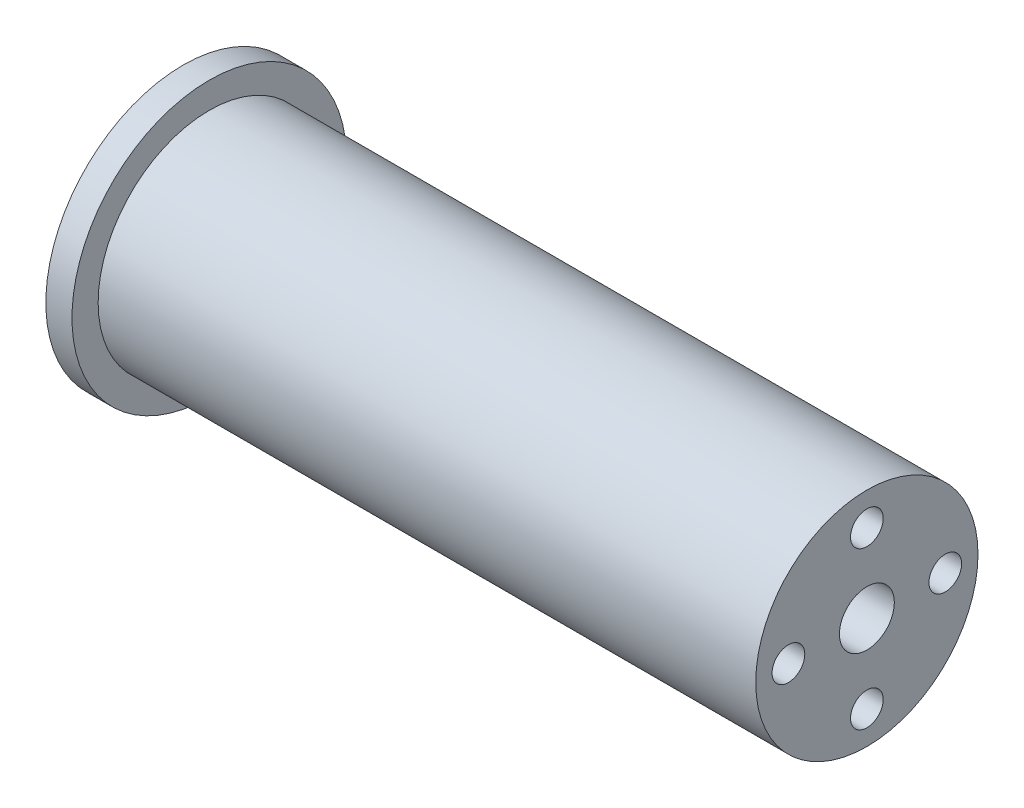
ISO-10303-21;
HEADER;
FILE_DESCRIPTION(('STEP AP214'),'2;1');
FILE_NAME('part.step','',(''),(''),'','','');
FILE_SCHEMA(('AUTOMOTIVE_DESIGN { 1 0 10303 214 1 1 1 1 }'));
ENDSEC;
DATA;
#1=APPLICATION_CONTEXT('core data for automotive mechanical design processes');
#2=APPLICATION_PROTOCOL_DEFINITION('international standard','automotive_design',2000,#1);
#3=PRODUCT_CONTEXT('',#1,'mechanical');
#4=PRODUCT('Part','Part','',(#3));
#5=PRODUCT_RELATED_PRODUCT_CATEGORY('part','',(#4));
#6=PRODUCT_DEFINITION_FORMATION('','',#4);
#7=PRODUCT_DEFINITION_CONTEXT('part definition',#1,'design');
#8=PRODUCT_DEFINITION('design','',#6,#7);
#9=PRODUCT_DEFINITION_SHAPE('','',#8);
#10=(LENGTH_UNIT() NAMED_UNIT(*) SI_UNIT(.MILLI.,.METRE.));
#11=(NAMED_UNIT(*) PLANE_ANGLE_UNIT() SI_UNIT($,.RADIAN.));
#12=(NAMED_UNIT(*) SI_UNIT($,.STERADIAN.) SOLID_ANGLE_UNIT());
#13=UNCERTAINTY_MEASURE_WITH_UNIT(LENGTH_MEASURE(1.E-05),#10,'distance_accuracy_value','');
#14=(GEOMETRIC_REPRESENTATION_CONTEXT(3) GLOBAL_UNCERTAINTY_ASSIGNED_CONTEXT((#13)) GLOBAL_UNIT_ASSIGNED_CONTEXT((#10,
#11,#12)) REPRESENTATION_CONTEXT('',''));
#15=CARTESIAN_POINT('',(0.,0.,0.));
#16=DIRECTION('',(0.,0.,1.));
#17=DIRECTION('',(1.,0.,0.));
#18=AXIS2_PLACEMENT_3D('',#15,#16,#17);
#19=CARTESIAN_POINT('',(57.3004303095137,-0.500000000036742,0.));
#20=DIRECTION('',(-1.,0.,0.));
#21=DIRECTION('',(0.,-1.,0.));
#22=AXIS2_PLACEMENT_3D('',#19,#20,#21);
#23=CYLINDRICAL_SURFACE('',#22,10.4999999999632);
#24=CARTESIAN_POINT('',(59.3004303095137,-0.500000000036742,0.));
#25=DIRECTION('',(-1.,0.,0.));
#26=DIRECTION('',(0.,-1.,0.));
#27=AXIS2_PLACEMENT_3D('',#24,#25,#26);
#28=CIRCLE('',#27,10.4999999999632);
#29=CARTESIAN_POINT('',(59.3004303095137,-11.,0.));
#30=VERTEX_POINT('',#29);
#31=EDGE_CURVE('E11',#30,#30,#28,.T.);
#32=ORIENTED_EDGE('',*,*,#31,.T.);
#33=EDGE_LOOP('',(#32));
#34=FACE_BOUND('',#33,.T.);
#35=CARTESIAN_POINT('',(57.3004303095137,-0.500000000036742,0.));
#36=DIRECTION('',(-1.,0.,0.));
#37=DIRECTION('',(0.,-1.,0.));
#38=AXIS2_PLACEMENT_3D('',#35,#36,#37);
#39=CIRCLE('',#38,10.4999999999632);
#40=CARTESIAN_POINT('',(57.3004303095137,-11.,0.));
#41=VERTEX_POINT('',#40);
#42=EDGE_CURVE('E96',#41,#41,#39,.T.);
#43=ORIENTED_EDGE('',*,*,#42,.F.);
#44=EDGE_LOOP('',(#43));
#45=FACE_BOUND('',#44,.T.);
#46=ADVANCED_FACE('F39',(#34,#45),#23,.T.);
#47=CARTESIAN_POINT('',(59.3004303095137,-11.,0.));
#48=DIRECTION('',(1.,0.,0.));
#49=DIRECTION('',(0.,1.,0.));
#50=AXIS2_PLACEMENT_3D('',#47,#48,#49);
#51=PLANE('',#50);
#52=CARTESIAN_POINT('',(59.3004303095138,-0.500000000036742,0.));
#53=DIRECTION('',(-1.,0.,0.));
#54=DIRECTION('',(0.,-1.,0.));
#55=AXIS2_PLACEMENT_3D('',#52,#53,#54);
#56=CIRCLE('',#55,8.49999999996325);
#57=CARTESIAN_POINT('',(59.3004303095138,-8.99999999999999,0.));
#58=VERTEX_POINT('',#57);
#59=EDGE_CURVE('E47',#58,#58,#56,.T.);
#60=ORIENTED_EDGE('',*,*,#59,.T.);
#61=EDGE_LOOP('',(#60));
#62=FACE_BOUND('',#61,.T.);
#63=ORIENTED_EDGE('',*,*,#31,.F.);
#64=EDGE_LOOP('',(#63));
#65=FACE_BOUND('',#64,.T.);
#66=ADVANCED_FACE('F132',(#62,#65),#51,.T.);
#67=CARTESIAN_POINT('',(57.3004303095137,-0.500000000036742,0.));
#68=DIRECTION('',(-1.,0.,0.));
#69=DIRECTION('',(0.,-1.,0.));
#70=AXIS2_PLACEMENT_3D('',#67,#68,#69);
#71=CYLINDRICAL_SURFACE('',#70,8.49999999996325);
#72=CARTESIAN_POINT('',(109.600860619028,-0.500000000036732,0.));
#73=DIRECTION('',(-1.,0.,0.));
#74=DIRECTION('',(0.,-1.,0.));
#75=AXIS2_PLACEMENT_3D('',#72,#73,#74);
#76=CIRCLE('',#75,8.49999999996325);
#77=CARTESIAN_POINT('',(109.600860619028,-8.99999999999998,0.));
#78=VERTEX_POINT('',#77);
#79=EDGE_CURVE('E99',#78,#78,#76,.T.);
#80=ORIENTED_EDGE('',*,*,#79,.T.);
#81=EDGE_LOOP('',(#80));
#82=FACE_BOUND('',#81,.T.);
#83=ORIENTED_EDGE('',*,*,#59,.F.);
#84=EDGE_LOOP('',(#83));
#85=FACE_BOUND('',#84,.T.);
#86=ADVANCED_FACE('F137',(#82,#85),#71,.T.);
#87=CARTESIAN_POINT('',(109.600860619028,-0.500000000036732,0.));
#88=DIRECTION('',(1.,0.,0.));
#89=DIRECTION('',(0.,1.,0.));
#90=AXIS2_PLACEMENT_3D('',#87,#88,#89);
#91=PLANE('',#90);
#92=CARTESIAN_POINT('',(109.600860619028,-0.499999999999996,0.));
#93=DIRECTION('',(1.,0.,0.));
#94=DIRECTION('',(0.,0.,-1.));
#95=AXIS2_PLACEMENT_3D('',#92,#93,#94);
#96=CIRCLE('',#95,2.1);
#97=CARTESIAN_POINT('',(109.600860619028,-0.499999999999996,-2.1));
#98=VERTEX_POINT('',#97);
#99=EDGE_CURVE('E108',#98,#98,#96,.T.);
#100=ORIENTED_EDGE('',*,*,#99,.F.);
#101=EDGE_LOOP('',(#100));
#102=FACE_BOUND('',#101,.T.);
#103=CARTESIAN_POINT('',(109.600860619028,-0.500000000036795,-5.99999999996325));
#104=DIRECTION('',(1.,0.,0.));
#105=DIRECTION('',(0.,0.,-1.));
#106=AXIS2_PLACEMENT_3D('',#103,#104,#105);
#107=CIRCLE('',#106,1.25);
#108=CARTESIAN_POINT('',(109.600860619028,-0.500000000036795,-7.24999999996325));
#109=VERTEX_POINT('',#108);
#110=EDGE_CURVE('E72',#109,#109,#107,.T.);
#111=ORIENTED_EDGE('',*,*,#110,.F.);
#112=EDGE_LOOP('',(#111));
#113=FACE_BOUND('',#112,.T.);
#114=CARTESIAN_POINT('',(109.600860619028,5.49999999992652,0.));
#115=DIRECTION('',(1.,0.,0.));
#116=DIRECTION('',(0.,0.,-1.));
#117=AXIS2_PLACEMENT_3D('',#114,#115,#116);
#118=CIRCLE('',#117,1.25);
#119=CARTESIAN_POINT('',(109.600860619028,5.49999999992652,-1.25));
#120=VERTEX_POINT('',#119);
#121=EDGE_CURVE('E71',#120,#120,#118,.T.);
#122=ORIENTED_EDGE('',*,*,#121,.F.);
#123=EDGE_LOOP('',(#122));
#124=FACE_BOUND('',#123,.T.);
#125=CARTESIAN_POINT('',(109.600860619028,-0.500000000036711,5.99999999996325));
#126=DIRECTION('',(1.,0.,0.));
#127=DIRECTION('',(0.,0.,-1.));
#128=AXIS2_PLACEMENT_3D('',#125,#126,#127);
#129=CIRCLE('',#128,1.25);
#130=CARTESIAN_POINT('',(109.600860619028,-0.500000000036711,4.74999999996325));
#131=VERTEX_POINT('',#130);
#132=EDGE_CURVE('E84',#131,#131,#129,.T.);
#133=ORIENTED_EDGE('',*,*,#132,.F.);
#134=EDGE_LOOP('',(#133));
#135=FACE_BOUND('',#134,.T.);
#136=CARTESIAN_POINT('',(109.600860619028,-6.49999999999998,0.));
#137=DIRECTION('',(1.,0.,0.));
#138=DIRECTION('',(0.,0.,-1.));
#139=AXIS2_PLACEMENT_3D('',#136,#137,#138);
#140=CIRCLE('',#139,1.25);
#141=CARTESIAN_POINT('',(109.600860619028,-6.49999999999998,-1.25));
#142=VERTEX_POINT('',#141);
#143=EDGE_CURVE('E90',#142,#142,#140,.T.);
#144=ORIENTED_EDGE('',*,*,#143,.F.);
#145=EDGE_LOOP('',(#144));
#146=FACE_BOUND('',#145,.T.);
#147=ORIENTED_EDGE('',*,*,#79,.F.);
#148=EDGE_LOOP('',(#147));
#149=FACE_BOUND('',#148,.T.);
#150=ADVANCED_FACE('F127',(#102,#113,#124,#135,#146,#149),#91,.T.);
#151=CARTESIAN_POINT('',(57.3004303095137,-11.,0.));
#152=DIRECTION('',(-1.,0.,0.));
#153=DIRECTION('',(0.,-1.,0.));
#154=AXIS2_PLACEMENT_3D('',#151,#152,#153);
#155=PLANE('',#154);
#156=CARTESIAN_POINT('',(57.3004303095137,-0.500000000000004,0.));
#157=DIRECTION('',(-1.,0.,0.));
#158=DIRECTION('',(0.,0.,1.));
#159=AXIS2_PLACEMENT_3D('',#156,#157,#158);
#160=CIRCLE('',#159,2.5);
#161=CARTESIAN_POINT('',(57.3004303095137,-0.500000000000004,2.5));
#162=VERTEX_POINT('',#161);
#163=EDGE_CURVE('E117',#162,#162,#160,.T.);
#164=ORIENTED_EDGE('',*,*,#163,.F.);
#165=EDGE_LOOP('',(#164));
#166=FACE_BOUND('',#165,.T.);
#167=ORIENTED_EDGE('',*,*,#42,.T.);
#168=EDGE_LOOP('',(#167));
#169=FACE_BOUND('',#168,.T.);
#170=ADVANCED_FACE('F123',(#166,#169),#155,.T.);
#171=CARTESIAN_POINT('',(103.600860619028,-6.49999999999998,0.));
#172=DIRECTION('',(1.,0.,0.));
#173=DIRECTION('',(0.,0.,-1.));
#174=AXIS2_PLACEMENT_3D('',#171,#172,#173);
#175=CONICAL_SURFACE('',#174,1.25,1.02974425867666);
#176=CARTESIAN_POINT('',(102.849784845243,-6.49999999999998,0.));
#177=VERTEX_POINT('',#176);
#178=VERTEX_LOOP('',#177);
#179=FACE_BOUND('',#178,.T.);
#180=CARTESIAN_POINT('',(103.600860619028,-6.49999999999998,0.));
#181=DIRECTION('',(1.,0.,0.));
#182=DIRECTION('',(0.,0.,-1.));
#183=AXIS2_PLACEMENT_3D('',#180,#181,#182);
#184=CIRCLE('',#183,1.25);
#185=CARTESIAN_POINT('',(103.600860619028,-6.49999999999998,-1.25));
#186=VERTEX_POINT('',#185);
#187=EDGE_CURVE('E93',#186,#186,#184,.T.);
#188=ORIENTED_EDGE('',*,*,#187,.T.);
#189=EDGE_LOOP('',(#188));
#190=FACE_BOUND('',#189,.T.);
#191=ADVANCED_FACE('F126',(#179,#190),#175,.F.);
#192=CARTESIAN_POINT('',(109.600860619028,-6.49999999999998,0.));
#193=DIRECTION('',(1.,0.,0.));
#194=DIRECTION('',(0.,0.,-1.));
#195=AXIS2_PLACEMENT_3D('',#192,#193,#194);
#196=CYLINDRICAL_SURFACE('',#195,1.25);
#197=ORIENTED_EDGE('',*,*,#187,.F.);
#198=EDGE_LOOP('',(#197));
#199=FACE_BOUND('',#198,.T.);
#200=ORIENTED_EDGE('',*,*,#143,.T.);
#201=EDGE_LOOP('',(#200));
#202=FACE_BOUND('',#201,.T.);
#203=ADVANCED_FACE('F152',(#199,#202),#196,.F.);
#204=CARTESIAN_POINT('',(103.600860619028,-0.500000000036711,5.99999999996325));
#205=DIRECTION('',(1.,0.,0.));
#206=DIRECTION('',(0.,0.,-1.));
#207=AXIS2_PLACEMENT_3D('',#204,#205,#206);
#208=CONICAL_SURFACE('',#207,1.25,1.02974425867666);
#209=CARTESIAN_POINT('',(102.849784845243,-0.500000000036713,5.99999999996325));
#210=VERTEX_POINT('',#209);
#211=VERTEX_LOOP('',#210);
#212=FACE_BOUND('',#211,.T.);
#213=CARTESIAN_POINT('',(103.600860619028,-0.500000000036711,5.99999999996325));
#214=DIRECTION('',(1.,0.,0.));
#215=DIRECTION('',(0.,0.,-1.));
#216=AXIS2_PLACEMENT_3D('',#213,#214,#215);
#217=CIRCLE('',#216,1.25);
#218=CARTESIAN_POINT('',(103.600860619028,-0.500000000036711,4.74999999996325));
#219=VERTEX_POINT('',#218);
#220=EDGE_CURVE('E87',#219,#219,#217,.T.);
#221=ORIENTED_EDGE('',*,*,#220,.T.);
#222=EDGE_LOOP('',(#221));
#223=FACE_BOUND('',#222,.T.);
#224=ADVANCED_FACE('F155',(#212,#223),#208,.F.);
#225=CARTESIAN_POINT('',(109.600860619028,-0.500000000036711,5.99999999996325));
#226=DIRECTION('',(1.,0.,0.));
#227=DIRECTION('',(0.,0.,-1.));
#228=AXIS2_PLACEMENT_3D('',#225,#226,#227);
#229=CYLINDRICAL_SURFACE('',#228,1.25);
#230=ORIENTED_EDGE('',*,*,#220,.F.);
#231=EDGE_LOOP('',(#230));
#232=FACE_BOUND('',#231,.T.);
#233=ORIENTED_EDGE('',*,*,#132,.T.);
#234=EDGE_LOOP('',(#233));
#235=FACE_BOUND('',#234,.T.);
#236=ADVANCED_FACE('F159',(#232,#235),#229,.F.);
#237=CARTESIAN_POINT('',(103.600860619028,5.49999999992652,0.));
#238=DIRECTION('',(1.,0.,0.));
#239=DIRECTION('',(0.,0.,-1.));
#240=AXIS2_PLACEMENT_3D('',#237,#238,#239);
#241=CONICAL_SURFACE('',#240,1.25,1.02974425867666);
#242=CARTESIAN_POINT('',(102.849784845243,5.49999999992651,0.));
#243=VERTEX_POINT('',#242);
#244=VERTEX_LOOP('',#243);
#245=FACE_BOUND('',#244,.T.);
#246=CARTESIAN_POINT('',(103.600860619028,5.49999999992652,0.));
#247=DIRECTION('',(1.,0.,0.));
#248=DIRECTION('',(0.,0.,-1.));
#249=AXIS2_PLACEMENT_3D('',#246,#247,#248);
#250=CIRCLE('',#249,1.25);
#251=CARTESIAN_POINT('',(103.600860619028,5.49999999992652,-1.25));
#252=VERTEX_POINT('',#251);
#253=EDGE_CURVE('E75',#252,#252,#250,.T.);
#254=ORIENTED_EDGE('',*,*,#253,.T.);
#255=EDGE_LOOP('',(#254));
#256=FACE_BOUND('',#255,.T.);
#257=ADVANCED_FACE('F162',(#245,#256),#241,.F.);
#258=CARTESIAN_POINT('',(109.600860619028,5.49999999992652,0.));
#259=DIRECTION('',(1.,0.,0.));
#260=DIRECTION('',(0.,0.,-1.));
#261=AXIS2_PLACEMENT_3D('',#258,#259,#260);
#262=CYLINDRICAL_SURFACE('',#261,1.25);
#263=ORIENTED_EDGE('',*,*,#253,.F.);
#264=EDGE_LOOP('',(#263));
#265=FACE_BOUND('',#264,.T.);
#266=ORIENTED_EDGE('',*,*,#121,.T.);
#267=EDGE_LOOP('',(#266));
#268=FACE_BOUND('',#267,.T.);
#269=ADVANCED_FACE('F65',(#265,#268),#262,.F.);
#270=CARTESIAN_POINT('',(103.600860619028,-0.500000000036795,-5.99999999996325));
#271=DIRECTION('',(1.,0.,0.));
#272=DIRECTION('',(0.,0.,-1.));
#273=AXIS2_PLACEMENT_3D('',#270,#271,#272);
#274=CONICAL_SURFACE('',#273,1.25,1.02974425867666);
#275=CARTESIAN_POINT('',(102.849784845243,-0.500000000036797,-5.99999999996325));
#276=VERTEX_POINT('',#275);
#277=VERTEX_LOOP('',#276);
#278=FACE_BOUND('',#277,.T.);
#279=CARTESIAN_POINT('',(103.600860619028,-0.500000000036795,-5.99999999996325));
#280=DIRECTION('',(1.,0.,0.));
#281=DIRECTION('',(0.,0.,-1.));
#282=AXIS2_PLACEMENT_3D('',#279,#280,#281);
#283=CIRCLE('',#282,1.25);
#284=CARTESIAN_POINT('',(103.600860619028,-0.500000000036795,-7.24999999996325));
#285=VERTEX_POINT('',#284);
#286=EDGE_CURVE('E69',#285,#285,#283,.T.);
#287=ORIENTED_EDGE('',*,*,#286,.T.);
#288=EDGE_LOOP('',(#287));
#289=FACE_BOUND('',#288,.T.);
#290=ADVANCED_FACE('F61',(#278,#289),#274,.F.);
#291=CARTESIAN_POINT('',(109.600860619028,-0.500000000036795,-5.99999999996325));
#292=DIRECTION('',(1.,0.,0.));
#293=DIRECTION('',(0.,0.,-1.));
#294=AXIS2_PLACEMENT_3D('',#291,#292,#293);
#295=CYLINDRICAL_SURFACE('',#294,1.25);
#296=ORIENTED_EDGE('',*,*,#286,.F.);
#297=EDGE_LOOP('',(#296));
#298=FACE_BOUND('',#297,.T.);
#299=ORIENTED_EDGE('',*,*,#110,.T.);
#300=EDGE_LOOP('',(#299));
#301=FACE_BOUND('',#300,.T.);
#302=ADVANCED_FACE('F64',(#298,#301),#295,.F.);
#303=CARTESIAN_POINT('',(109.600860619028,-0.500000000000001,0.));
#304=DIRECTION('',(1.,0.,0.));
#305=DIRECTION('',(0.,0.,-1.));
#306=AXIS2_PLACEMENT_3D('',#303,#304,#305);
#307=CYLINDRICAL_SURFACE('',#306,1.49999999999999);
#308=CARTESIAN_POINT('',(87.0000000000003,-0.500000000000004,0.));
#309=DIRECTION('',(-1.,0.,0.));
#310=DIRECTION('',(0.,0.,1.));
#311=AXIS2_PLACEMENT_3D('',#308,#309,#310);
#312=CIRCLE('',#311,1.49999999999999);
#313=CARTESIAN_POINT('',(87.0000000000003,-0.500000000000004,1.49999999999999));
#314=VERTEX_POINT('',#313);
#315=EDGE_CURVE('E42',#314,#314,#312,.T.);
#316=ORIENTED_EDGE('',*,*,#315,.T.);
#317=EDGE_LOOP('',(#316));
#318=FACE_BOUND('',#317,.T.);
#319=CARTESIAN_POINT('',(99.,-0.499999999999996,0.));
#320=DIRECTION('',(1.,0.,0.));
#321=DIRECTION('',(0.,0.,-1.));
#322=AXIS2_PLACEMENT_3D('',#319,#320,#321);
#323=CIRCLE('',#322,1.49999999999999);
#324=CARTESIAN_POINT('',(99.,-0.499999999999996,-1.49999999999999));
#325=VERTEX_POINT('',#324);
#326=EDGE_CURVE('E78',#325,#325,#323,.T.);
#327=ORIENTED_EDGE('',*,*,#326,.T.);
#328=EDGE_LOOP('',(#327));
#329=FACE_BOUND('',#328,.T.);
#330=ADVANCED_FACE('F172',(#318,#329),#307,.F.);
#331=CARTESIAN_POINT('',(99.3605163714166,-0.499999999999996,0.));
#332=DIRECTION('',(1.,0.,0.));
#333=DIRECTION('',(0.,0.,-1.));
#334=AXIS2_PLACEMENT_3D('',#331,#332,#333);
#335=CONICAL_SURFACE('',#334,2.1,1.02974425867665);
#336=CARTESIAN_POINT('',(99.3605163714166,-0.499999999999996,0.));
#337=DIRECTION('',(1.,0.,0.));
#338=DIRECTION('',(0.,0.,-1.));
#339=AXIS2_PLACEMENT_3D('',#336,#337,#338);
#340=CIRCLE('',#339,2.1);
#341=CARTESIAN_POINT('',(99.3605163714166,-0.499999999999996,-2.1));
#342=VERTEX_POINT('',#341);
#343=EDGE_CURVE('E104',#342,#342,#340,.T.);
#344=ORIENTED_EDGE('',*,*,#343,.T.);
#345=EDGE_LOOP('',(#344));
#346=FACE_BOUND('',#345,.T.);
#347=ORIENTED_EDGE('',*,*,#326,.F.);
#348=EDGE_LOOP('',(#347));
#349=FACE_BOUND('',#348,.T.);
#350=ADVANCED_FACE('F175',(#346,#349),#335,.F.);
#351=CARTESIAN_POINT('',(109.600860619028,-0.499999999999996,0.));
#352=DIRECTION('',(1.,0.,0.));
#353=DIRECTION('',(0.,0.,-1.));
#354=AXIS2_PLACEMENT_3D('',#351,#352,#353);
#355=CYLINDRICAL_SURFACE('',#354,2.1);
#356=ORIENTED_EDGE('',*,*,#343,.F.);
#357=EDGE_LOOP('',(#356));
#358=FACE_BOUND('',#357,.T.);
#359=ORIENTED_EDGE('',*,*,#99,.T.);
#360=EDGE_LOOP('',(#359));
#361=FACE_BOUND('',#360,.T.);
#362=ADVANCED_FACE('F179',(#358,#361),#355,.F.);
#363=CARTESIAN_POINT('',(86.3991393809727,-0.500000000000004,0.));
#364=DIRECTION('',(-1.,0.,0.));
#365=DIRECTION('',(0.,0.,1.));
#366=AXIS2_PLACEMENT_3D('',#363,#364,#365);
#367=CONICAL_SURFACE('',#366,2.49999999999999,1.02974425867665);
#368=CARTESIAN_POINT('',(86.3991393809727,-0.500000000000004,0.));
#369=DIRECTION('',(-1.,0.,0.));
#370=DIRECTION('',(0.,0.,1.));
#371=AXIS2_PLACEMENT_3D('',#368,#369,#370);
#372=CIRCLE('',#371,2.49999999999999);
#373=CARTESIAN_POINT('',(86.3991393809727,-0.500000000000004,2.49999999999999));
#374=VERTEX_POINT('',#373);
#375=EDGE_CURVE('E114',#374,#374,#372,.T.);
#376=ORIENTED_EDGE('',*,*,#375,.T.);
#377=EDGE_LOOP('',(#376));
#378=FACE_BOUND('',#377,.T.);
#379=ORIENTED_EDGE('',*,*,#315,.F.);
#380=EDGE_LOOP('',(#379));
#381=FACE_BOUND('',#380,.T.);
#382=ADVANCED_FACE('F182',(#378,#381),#367,.F.);
#383=CARTESIAN_POINT('',(57.3004303095137,-0.500000000000004,0.));
#384=DIRECTION('',(-1.,0.,0.));
#385=DIRECTION('',(0.,0.,1.));
#386=AXIS2_PLACEMENT_3D('',#383,#384,#385);
#387=CYLINDRICAL_SURFACE('',#386,2.5);
#388=ORIENTED_EDGE('',*,*,#375,.F.);
#389=EDGE_LOOP('',(#388));
#390=FACE_BOUND('',#389,.T.);
#391=ORIENTED_EDGE('',*,*,#163,.T.);
#392=EDGE_LOOP('',(#391));
#393=FACE_BOUND('',#392,.T.);
#394=ADVANCED_FACE('F121',(#390,#393),#387,.F.);
#395=CLOSED_SHELL('',(#46,#66,#86,#150,#170,#191,#203,#224,#236,#257,#269,#290,#302,#330,#350,
#362,#382,#394));
#396=MANIFOLD_SOLID_BREP('B2',#395);
#397=ADVANCED_BREP_SHAPE_REPRESENTATION('',(#18,#396),#14);
#398=SHAPE_DEFINITION_REPRESENTATION(#9,#397);
ENDSEC;
END-ISO-10303-21;
